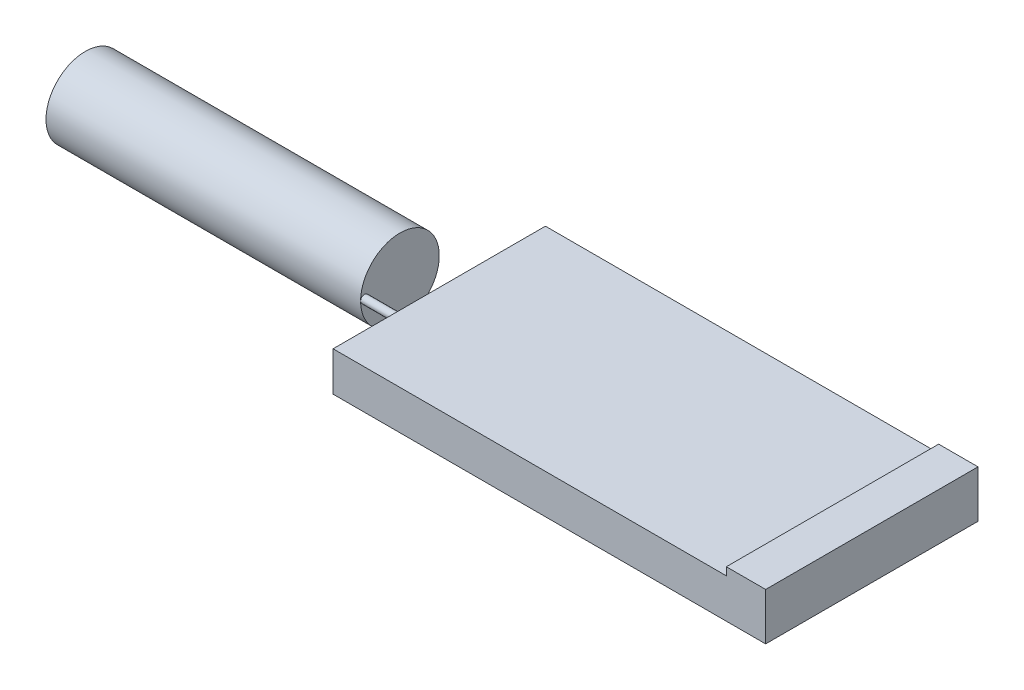
ISO-10303-21;
HEADER;
FILE_DESCRIPTION(('STEP AP214'),'2;1');
FILE_NAME('part.step','',(''),(''),'','','');
FILE_SCHEMA(('AUTOMOTIVE_DESIGN { 1 0 10303 214 1 1 1 1 }'));
ENDSEC;
DATA;
#1=APPLICATION_CONTEXT('core data for automotive mechanical design processes');
#2=APPLICATION_PROTOCOL_DEFINITION('international standard','automotive_design',2000,#1);
#3=PRODUCT_CONTEXT('',#1,'mechanical');
#4=PRODUCT('Part','Part','',(#3));
#5=PRODUCT_RELATED_PRODUCT_CATEGORY('part','',(#4));
#6=PRODUCT_DEFINITION_FORMATION('','',#4);
#7=PRODUCT_DEFINITION_CONTEXT('part definition',#1,'design');
#8=PRODUCT_DEFINITION('design','',#6,#7);
#9=PRODUCT_DEFINITION_SHAPE('','',#8);
#10=(LENGTH_UNIT() NAMED_UNIT(*) SI_UNIT(.MILLI.,.METRE.));
#11=(NAMED_UNIT(*) PLANE_ANGLE_UNIT() SI_UNIT($,.RADIAN.));
#12=(NAMED_UNIT(*) SI_UNIT($,.STERADIAN.) SOLID_ANGLE_UNIT());
#13=UNCERTAINTY_MEASURE_WITH_UNIT(LENGTH_MEASURE(1.E-05),#10,'distance_accuracy_value','');
#14=(GEOMETRIC_REPRESENTATION_CONTEXT(3) GLOBAL_UNCERTAINTY_ASSIGNED_CONTEXT((#13)) GLOBAL_UNIT_ASSIGNED_CONTEXT((#10,
#11,#12)) REPRESENTATION_CONTEXT('',''));
#15=CARTESIAN_POINT('',(0.,0.,0.));
#16=DIRECTION('',(0.,0.,1.));
#17=DIRECTION('',(1.,0.,0.));
#18=AXIS2_PLACEMENT_3D('',#15,#16,#17);
#19=CARTESIAN_POINT('',(13.75,2.5,6.75));
#20=DIRECTION('',(-1.,0.,0.));
#21=DIRECTION('',(0.,0.,1.));
#22=AXIS2_PLACEMENT_3D('',#19,#20,#21);
#23=PLANE('',#22);
#24=DIRECTION('',(0.,0.,-1.));
#25=VECTOR('',#24,1.);
#26=CARTESIAN_POINT('',(13.75,0.,6.75));
#27=LINE('',#26,#25);
#28=CARTESIAN_POINT('',(13.75,0.,6.75));
#29=VERTEX_POINT('',#28);
#30=CARTESIAN_POINT('',(13.75,0.,-6.75));
#31=VERTEX_POINT('',#30);
#32=EDGE_CURVE('E97',#29,#31,#27,.T.);
#33=ORIENTED_EDGE('',*,*,#32,.T.);
#34=DIRECTION('',(0.,-1.,0.));
#35=VECTOR('',#34,1.);
#36=CARTESIAN_POINT('',(13.75,2.5,-6.75));
#37=LINE('',#36,#35);
#38=CARTESIAN_POINT('',(13.75,3.,-6.75));
#39=VERTEX_POINT('',#38);
#40=EDGE_CURVE('E42',#39,#31,#37,.T.);
#41=ORIENTED_EDGE('',*,*,#40,.F.);
#42=DIRECTION('',(0.,0.,1.));
#43=VECTOR('',#42,1.);
#44=CARTESIAN_POINT('',(13.75,3.,0.));
#45=LINE('',#44,#43);
#46=CARTESIAN_POINT('',(13.75,3.,6.75));
#47=VERTEX_POINT('',#46);
#48=EDGE_CURVE('E99',#39,#47,#45,.T.);
#49=ORIENTED_EDGE('',*,*,#48,.T.);
#50=DIRECTION('',(0.,-1.,0.));
#51=VECTOR('',#50,1.);
#52=CARTESIAN_POINT('',(13.75,2.5,6.75));
#53=LINE('',#52,#51);
#54=EDGE_CURVE('E83',#47,#29,#53,.T.);
#55=ORIENTED_EDGE('',*,*,#54,.T.);
#56=EDGE_LOOP('',(#33,#41,#49,#55));
#57=FACE_BOUND('',#56,.T.);
#58=ADVANCED_FACE('F35',(#57),#23,.F.);
#59=CARTESIAN_POINT('',(-13.75,2.5,-6.75));
#60=DIRECTION('',(0.,0.,1.));
#61=DIRECTION('',(1.,0.,0.));
#62=AXIS2_PLACEMENT_3D('',#59,#60,#61);
#63=PLANE('',#62);
#64=DIRECTION('',(-1.,0.,0.));
#65=VECTOR('',#64,1.);
#66=CARTESIAN_POINT('',(-13.75,2.5,-6.75));
#67=LINE('',#66,#65);
#68=CARTESIAN_POINT('',(11.25,2.5,-6.75));
#69=VERTEX_POINT('',#68);
#70=CARTESIAN_POINT('',(-13.75,2.5,-6.75));
#71=VERTEX_POINT('',#70);
#72=EDGE_CURVE('E90',#69,#71,#67,.T.);
#73=ORIENTED_EDGE('',*,*,#72,.F.);
#74=DIRECTION('',(0.,-1.,0.));
#75=VECTOR('',#74,1.);
#76=CARTESIAN_POINT('',(11.25,3.,-6.75));
#77=LINE('',#76,#75);
#78=CARTESIAN_POINT('',(11.25,3.,-6.75));
#79=VERTEX_POINT('',#78);
#80=EDGE_CURVE('E49',#79,#69,#77,.T.);
#81=ORIENTED_EDGE('',*,*,#80,.F.);
#82=DIRECTION('',(1.,0.,0.));
#83=VECTOR('',#82,1.);
#84=CARTESIAN_POINT('',(0.,3.,-6.75));
#85=LINE('',#84,#83);
#86=EDGE_CURVE('E123',#79,#39,#85,.T.);
#87=ORIENTED_EDGE('',*,*,#86,.T.);
#88=ORIENTED_EDGE('',*,*,#40,.T.);
#89=DIRECTION('',(-1.,0.,0.));
#90=VECTOR('',#89,1.);
#91=CARTESIAN_POINT('',(-13.75,0.,-6.75));
#92=LINE('',#91,#90);
#93=CARTESIAN_POINT('',(-13.75,0.,-6.75));
#94=VERTEX_POINT('',#93);
#95=EDGE_CURVE('E103',#31,#94,#92,.T.);
#96=ORIENTED_EDGE('',*,*,#95,.T.);
#97=DIRECTION('',(0.,-1.,0.));
#98=VECTOR('',#97,1.);
#99=CARTESIAN_POINT('',(-13.75,2.5,-6.75));
#100=LINE('',#99,#98);
#101=EDGE_CURVE('E114',#71,#94,#100,.T.);
#102=ORIENTED_EDGE('',*,*,#101,.F.);
#103=EDGE_LOOP('',(#73,#81,#87,#88,#96,#102));
#104=FACE_BOUND('',#103,.T.);
#105=ADVANCED_FACE('F119',(#104),#63,.F.);
#106=CARTESIAN_POINT('',(-13.75,2.5,6.75));
#107=DIRECTION('',(1.,0.,0.));
#108=DIRECTION('',(0.,0.,-1.));
#109=AXIS2_PLACEMENT_3D('',#106,#107,#108);
#110=PLANE('',#109);
#111=CARTESIAN_POINT('',(-13.75,1.25,1.75));
#112=DIRECTION('',(1.,0.,0.));
#113=DIRECTION('',(0.,0.,-1.));
#114=AXIS2_PLACEMENT_3D('',#111,#112,#113);
#115=CIRCLE('',#114,0.25);
#116=CARTESIAN_POINT('',(-13.75,1.25,1.5));
#117=VERTEX_POINT('',#116);
#118=EDGE_CURVE('E11',#117,#117,#115,.F.);
#119=ORIENTED_EDGE('',*,*,#118,.F.);
#120=EDGE_LOOP('',(#119));
#121=FACE_BOUND('',#120,.T.);
#122=DIRECTION('',(0.,0.,1.));
#123=VECTOR('',#122,1.);
#124=CARTESIAN_POINT('',(-13.75,0.,6.75));
#125=LINE('',#124,#123);
#126=CARTESIAN_POINT('',(-13.75,0.,6.75));
#127=VERTEX_POINT('',#126);
#128=EDGE_CURVE('E91',#94,#127,#125,.T.);
#129=ORIENTED_EDGE('',*,*,#128,.T.);
#130=DIRECTION('',(0.,-1.,0.));
#131=VECTOR('',#130,1.);
#132=CARTESIAN_POINT('',(-13.75,2.5,6.75));
#133=LINE('',#132,#131);
#134=CARTESIAN_POINT('',(-13.75,2.5,6.75));
#135=VERTEX_POINT('',#134);
#136=EDGE_CURVE('E86',#135,#127,#133,.T.);
#137=ORIENTED_EDGE('',*,*,#136,.F.);
#138=DIRECTION('',(0.,0.,1.));
#139=VECTOR('',#138,1.);
#140=CARTESIAN_POINT('',(-13.75,2.5,6.75));
#141=LINE('',#140,#139);
#142=EDGE_CURVE('E58',#71,#135,#141,.T.);
#143=ORIENTED_EDGE('',*,*,#142,.F.);
#144=ORIENTED_EDGE('',*,*,#101,.T.);
#145=EDGE_LOOP('',(#129,#137,#143,#144));
#146=FACE_BOUND('',#145,.T.);
#147=ADVANCED_FACE('F176',(#121,#146),#110,.F.);
#148=CARTESIAN_POINT('',(-13.75,2.5,6.75));
#149=DIRECTION('',(0.,0.,-1.));
#150=DIRECTION('',(-1.,0.,0.));
#151=AXIS2_PLACEMENT_3D('',#148,#149,#150);
#152=PLANE('',#151);
#153=DIRECTION('',(1.,0.,0.));
#154=VECTOR('',#153,1.);
#155=CARTESIAN_POINT('',(-13.75,0.,6.75));
#156=LINE('',#155,#154);
#157=EDGE_CURVE('E78',#127,#29,#156,.T.);
#158=ORIENTED_EDGE('',*,*,#157,.T.);
#159=ORIENTED_EDGE('',*,*,#54,.F.);
#160=DIRECTION('',(-1.,0.,0.));
#161=VECTOR('',#160,1.);
#162=CARTESIAN_POINT('',(0.,3.,6.75));
#163=LINE('',#162,#161);
#164=CARTESIAN_POINT('',(11.25,3.,6.75));
#165=VERTEX_POINT('',#164);
#166=EDGE_CURVE('E135',#47,#165,#163,.T.);
#167=ORIENTED_EDGE('',*,*,#166,.T.);
#168=DIRECTION('',(0.,-1.,0.));
#169=VECTOR('',#168,1.);
#170=CARTESIAN_POINT('',(11.25,3.,6.75));
#171=LINE('',#170,#169);
#172=CARTESIAN_POINT('',(11.25,2.5,6.75));
#173=VERTEX_POINT('',#172);
#174=EDGE_CURVE('E133',#165,#173,#171,.T.);
#175=ORIENTED_EDGE('',*,*,#174,.T.);
#176=DIRECTION('',(1.,0.,0.));
#177=VECTOR('',#176,1.);
#178=CARTESIAN_POINT('',(-13.75,2.5,6.75));
#179=LINE('',#178,#177);
#180=EDGE_CURVE('E100',#135,#173,#179,.T.);
#181=ORIENTED_EDGE('',*,*,#180,.F.);
#182=ORIENTED_EDGE('',*,*,#136,.T.);
#183=EDGE_LOOP('',(#158,#159,#167,#175,#181,#182));
#184=FACE_BOUND('',#183,.T.);
#185=ADVANCED_FACE('F80',(#184),#152,.F.);
#186=CARTESIAN_POINT('',(0.,2.5,0.));
#187=DIRECTION('',(0.,-1.,0.));
#188=DIRECTION('',(0.,0.,-1.));
#189=AXIS2_PLACEMENT_3D('',#186,#187,#188);
#190=PLANE('',#189);
#191=ORIENTED_EDGE('',*,*,#180,.T.);
#192=DIRECTION('',(0.,0.,-1.));
#193=VECTOR('',#192,1.);
#194=CARTESIAN_POINT('',(11.25,2.5,0.));
#195=LINE('',#194,#193);
#196=EDGE_CURVE('E105',#173,#69,#195,.T.);
#197=ORIENTED_EDGE('',*,*,#196,.T.);
#198=ORIENTED_EDGE('',*,*,#72,.T.);
#199=ORIENTED_EDGE('',*,*,#142,.T.);
#200=EDGE_LOOP('',(#191,#197,#198,#199));
#201=FACE_BOUND('',#200,.T.);
#202=ADVANCED_FACE('F137',(#201),#190,.F.);
#203=CARTESIAN_POINT('',(0.,0.,0.));
#204=DIRECTION('',(0.,-1.,0.));
#205=DIRECTION('',(0.,0.,-1.));
#206=AXIS2_PLACEMENT_3D('',#203,#204,#205);
#207=PLANE('',#206);
#208=ORIENTED_EDGE('',*,*,#128,.F.);
#209=ORIENTED_EDGE('',*,*,#95,.F.);
#210=ORIENTED_EDGE('',*,*,#32,.F.);
#211=ORIENTED_EDGE('',*,*,#157,.F.);
#212=EDGE_LOOP('',(#208,#209,#210,#211));
#213=FACE_BOUND('',#212,.T.);
#214=ADVANCED_FACE('F102',(#213),#207,.T.);
#215=CARTESIAN_POINT('',(11.25,3.,0.));
#216=DIRECTION('',(-1.,0.,0.));
#217=DIRECTION('',(0.,0.,1.));
#218=AXIS2_PLACEMENT_3D('',#215,#216,#217);
#219=PLANE('',#218);
#220=ORIENTED_EDGE('',*,*,#196,.F.);
#221=ORIENTED_EDGE('',*,*,#174,.F.);
#222=DIRECTION('',(0.,0.,-1.));
#223=VECTOR('',#222,1.);
#224=CARTESIAN_POINT('',(11.25,3.,0.));
#225=LINE('',#224,#223);
#226=EDGE_CURVE('E143',#165,#79,#225,.T.);
#227=ORIENTED_EDGE('',*,*,#226,.T.);
#228=ORIENTED_EDGE('',*,*,#80,.T.);
#229=EDGE_LOOP('',(#220,#221,#227,#228));
#230=FACE_BOUND('',#229,.T.);
#231=ADVANCED_FACE('F132',(#230),#219,.T.);
#232=CARTESIAN_POINT('',(0.,3.,0.));
#233=DIRECTION('',(0.,-1.,0.));
#234=DIRECTION('',(0.,0.,-1.));
#235=AXIS2_PLACEMENT_3D('',#232,#233,#234);
#236=PLANE('',#235);
#237=ORIENTED_EDGE('',*,*,#166,.F.);
#238=ORIENTED_EDGE('',*,*,#48,.F.);
#239=ORIENTED_EDGE('',*,*,#86,.F.);
#240=ORIENTED_EDGE('',*,*,#226,.F.);
#241=EDGE_LOOP('',(#237,#238,#239,#240));
#242=FACE_BOUND('',#241,.T.);
#243=ADVANCED_FACE('F172',(#242),#236,.F.);
#244=CARTESIAN_POINT('',(-16.75,1.25,1.75));
#245=DIRECTION('',(1.,0.,0.));
#246=DIRECTION('',(0.,0.,-1.));
#247=AXIS2_PLACEMENT_3D('',#244,#245,#246);
#248=CYLINDRICAL_SURFACE('',#247,0.25);
#249=CARTESIAN_POINT('',(-16.75,1.25,1.75));
#250=DIRECTION('',(-1.,0.,0.));
#251=DIRECTION('',(0.,0.,1.));
#252=AXIS2_PLACEMENT_3D('',#249,#250,#251);
#253=CIRCLE('',#252,0.25);
#254=CARTESIAN_POINT('',(-16.75,1.25,2.));
#255=VERTEX_POINT('',#254);
#256=EDGE_CURVE('E146',#255,#255,#253,.T.);
#257=ORIENTED_EDGE('',*,*,#256,.F.);
#258=EDGE_LOOP('',(#257));
#259=FACE_BOUND('',#258,.T.);
#260=ORIENTED_EDGE('',*,*,#118,.T.);
#261=EDGE_LOOP('',(#260));
#262=FACE_BOUND('',#261,.T.);
#263=ADVANCED_FACE('F161',(#259,#262),#248,.T.);
#264=CARTESIAN_POINT('',(-36.75,1.25,-0.500000000000001));
#265=DIRECTION('',(1.,0.,0.));
#266=DIRECTION('',(0.,0.,-1.));
#267=AXIS2_PLACEMENT_3D('',#264,#265,#266);
#268=CYLINDRICAL_SURFACE('',#267,2.5);
#269=CARTESIAN_POINT('',(-36.75,1.25,-0.500000000000001));
#270=DIRECTION('',(-1.,0.,0.));
#271=DIRECTION('',(0.,0.,1.));
#272=AXIS2_PLACEMENT_3D('',#269,#270,#271);
#273=CIRCLE('',#272,2.5);
#274=CARTESIAN_POINT('',(-36.75,1.25,2.));
#275=VERTEX_POINT('',#274);
#276=EDGE_CURVE('E149',#275,#275,#273,.T.);
#277=ORIENTED_EDGE('',*,*,#276,.F.);
#278=EDGE_LOOP('',(#277));
#279=FACE_BOUND('',#278,.T.);
#280=CARTESIAN_POINT('',(-16.75,1.25,-0.500000000000001));
#281=DIRECTION('',(-1.,0.,0.));
#282=DIRECTION('',(0.,0.,1.));
#283=AXIS2_PLACEMENT_3D('',#280,#281,#282);
#284=CIRCLE('',#283,2.5);
#285=EDGE_CURVE('E150',#255,#255,#284,.T.);
#286=ORIENTED_EDGE('',*,*,#285,.T.);
#287=EDGE_LOOP('',(#286));
#288=FACE_BOUND('',#287,.T.);
#289=ADVANCED_FACE('F158',(#279,#288),#268,.T.);
#290=CARTESIAN_POINT('',(-36.75,0.,0.));
#291=DIRECTION('',(-1.,0.,0.));
#292=DIRECTION('',(0.,0.,1.));
#293=AXIS2_PLACEMENT_3D('',#290,#291,#292);
#294=PLANE('',#293);
#295=ORIENTED_EDGE('',*,*,#276,.T.);
#296=EDGE_LOOP('',(#295));
#297=FACE_BOUND('',#296,.T.);
#298=ADVANCED_FACE('F156',(#297),#294,.T.);
#299=CARTESIAN_POINT('',(-16.75,0.,0.));
#300=DIRECTION('',(-1.,0.,0.));
#301=DIRECTION('',(0.,0.,1.));
#302=AXIS2_PLACEMENT_3D('',#299,#300,#301);
#303=PLANE('',#302);
#304=ORIENTED_EDGE('',*,*,#285,.F.);
#305=ORIENTED_EDGE('',*,*,#256,.T.);
#306=EDGE_LOOP('',(#304,#305));
#307=FACE_BOUND('',#306,.T.);
#308=ADVANCED_FACE('F168',(#307),#303,.F.);
#309=CLOSED_SHELL('',(#58,#105,#147,#185,#202,#214,#231,#243,#263,#289,#298,#308));
#310=MANIFOLD_SOLID_BREP('B2',#309);
#311=ADVANCED_BREP_SHAPE_REPRESENTATION('',(#18,#310),#14);
#312=SHAPE_DEFINITION_REPRESENTATION(#9,#311);
ENDSEC;
END-ISO-10303-21;
